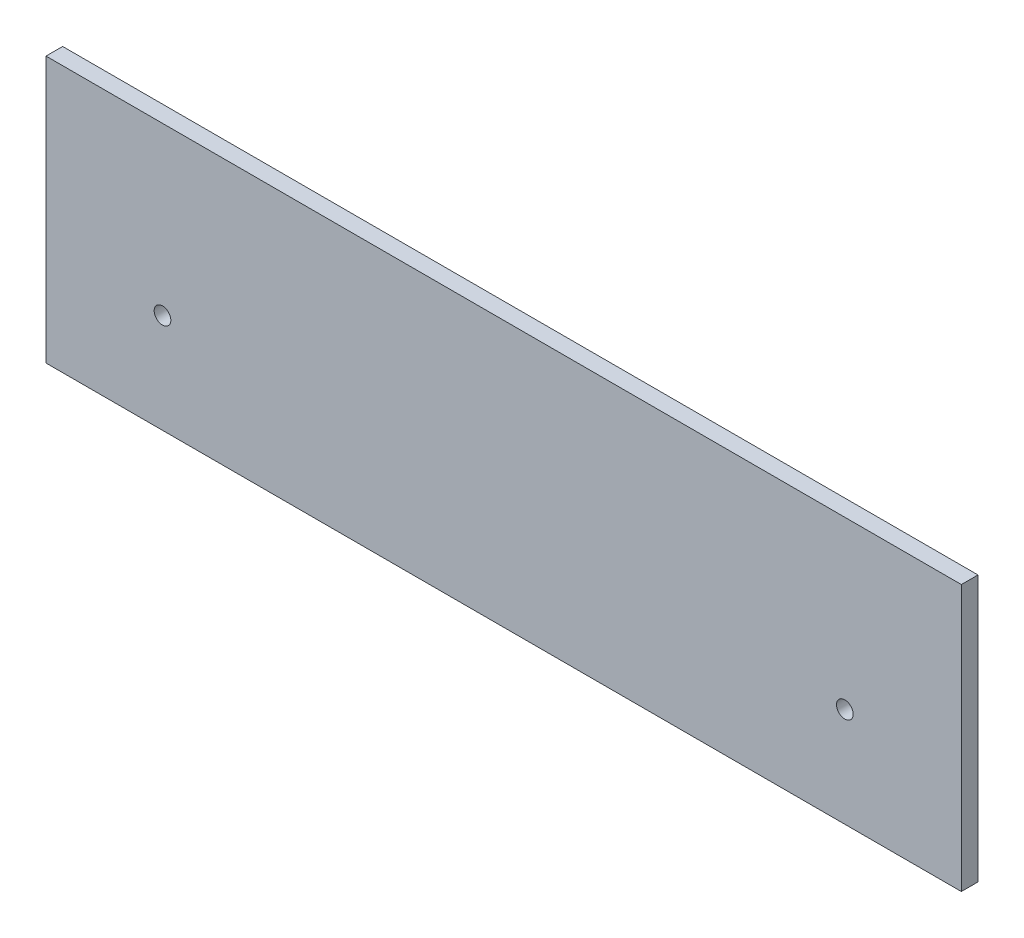
ISO-10303-21;
HEADER;
FILE_DESCRIPTION(('STEP AP214'),'2;1');
FILE_NAME('part.step','',(''),(''),'','','');
FILE_SCHEMA(('AUTOMOTIVE_DESIGN { 1 0 10303 214 1 1 1 1 }'));
ENDSEC;
DATA;
#1=APPLICATION_CONTEXT('core data for automotive mechanical design processes');
#2=APPLICATION_PROTOCOL_DEFINITION('international standard','automotive_design',2000,#1);
#3=PRODUCT_CONTEXT('',#1,'mechanical');
#4=PRODUCT('Part','Part','',(#3));
#5=PRODUCT_RELATED_PRODUCT_CATEGORY('part','',(#4));
#6=PRODUCT_DEFINITION_FORMATION('','',#4);
#7=PRODUCT_DEFINITION_CONTEXT('part definition',#1,'design');
#8=PRODUCT_DEFINITION('design','',#6,#7);
#9=PRODUCT_DEFINITION_SHAPE('','',#8);
#10=(LENGTH_UNIT() NAMED_UNIT(*) SI_UNIT(.MILLI.,.METRE.));
#11=(NAMED_UNIT(*) PLANE_ANGLE_UNIT() SI_UNIT($,.RADIAN.));
#12=(NAMED_UNIT(*) SI_UNIT($,.STERADIAN.) SOLID_ANGLE_UNIT());
#13=UNCERTAINTY_MEASURE_WITH_UNIT(LENGTH_MEASURE(1.E-05),#10,'distance_accuracy_value','');
#14=(GEOMETRIC_REPRESENTATION_CONTEXT(3) GLOBAL_UNCERTAINTY_ASSIGNED_CONTEXT((#13)) GLOBAL_UNIT_ASSIGNED_CONTEXT((#10,
#11,#12)) REPRESENTATION_CONTEXT('',''));
#15=CARTESIAN_POINT('',(0.,0.,0.));
#16=DIRECTION('',(0.,0.,1.));
#17=DIRECTION('',(1.,0.,0.));
#18=AXIS2_PLACEMENT_3D('',#15,#16,#17);
#19=CARTESIAN_POINT('',(0.,0.,1.));
#20=DIRECTION('',(1.,0.,0.));
#21=DIRECTION('',(0.,1.,0.));
#22=AXIS2_PLACEMENT_3D('',#19,#20,#21);
#23=PLANE('',#22);
#24=DIRECTION('',(0.,-1.,0.));
#25=VECTOR('',#24,1.);
#26=CARTESIAN_POINT('',(0.,0.,0.));
#27=LINE('',#26,#25);
#28=CARTESIAN_POINT('',(0.,0.,0.));
#29=VERTEX_POINT('',#28);
#30=CARTESIAN_POINT('',(0.,-15.9756079747164,0.));
#31=VERTEX_POINT('',#30);
#32=EDGE_CURVE('E92',#29,#31,#27,.T.);
#33=ORIENTED_EDGE('',*,*,#32,.T.);
#34=DIRECTION('',(0.,0.,1.));
#35=VECTOR('',#34,1.);
#36=CARTESIAN_POINT('',(0.,-15.9756079747164,-4.));
#37=LINE('',#36,#35);
#38=CARTESIAN_POINT('',(0.,-15.9756079747164,1.));
#39=VERTEX_POINT('',#38);
#40=EDGE_CURVE('E57',#31,#39,#37,.T.);
#41=ORIENTED_EDGE('',*,*,#40,.T.);
#42=DIRECTION('',(0.,-1.,0.));
#43=VECTOR('',#42,1.);
#44=CARTESIAN_POINT('',(0.,0.,1.));
#45=LINE('',#44,#43);
#46=CARTESIAN_POINT('',(0.,0.,1.));
#47=VERTEX_POINT('',#46);
#48=EDGE_CURVE('E87',#47,#39,#45,.T.);
#49=ORIENTED_EDGE('',*,*,#48,.F.);
#50=DIRECTION('',(0.,0.,-1.));
#51=VECTOR('',#50,1.);
#52=CARTESIAN_POINT('',(0.,0.,1.));
#53=LINE('',#52,#51);
#54=EDGE_CURVE('E81',#47,#29,#53,.T.);
#55=ORIENTED_EDGE('',*,*,#54,.T.);
#56=EDGE_LOOP('',(#33,#41,#49,#55));
#57=FACE_BOUND('',#56,.T.);
#58=ADVANCED_FACE('F43',(#57),#23,.F.);
#59=CARTESIAN_POINT('',(55.,0.,1.));
#60=DIRECTION('',(-1.,0.,0.));
#61=DIRECTION('',(0.,-1.,0.));
#62=AXIS2_PLACEMENT_3D('',#59,#60,#61);
#63=PLANE('',#62);
#64=DIRECTION('',(0.,1.,0.));
#65=VECTOR('',#64,1.);
#66=CARTESIAN_POINT('',(55.,0.,1.));
#67=LINE('',#66,#65);
#68=CARTESIAN_POINT('',(55.,-15.9756079747164,1.));
#69=VERTEX_POINT('',#68);
#70=CARTESIAN_POINT('',(55.,0.,1.));
#71=VERTEX_POINT('',#70);
#72=EDGE_CURVE('E103',#69,#71,#67,.T.);
#73=ORIENTED_EDGE('',*,*,#72,.F.);
#74=DIRECTION('',(0.,0.,1.));
#75=VECTOR('',#74,1.);
#76=CARTESIAN_POINT('',(55.,-15.9756079747164,-4.));
#77=LINE('',#76,#75);
#78=CARTESIAN_POINT('',(55.,-15.9756079747164,0.));
#79=VERTEX_POINT('',#78);
#80=EDGE_CURVE('E114',#79,#69,#77,.T.);
#81=ORIENTED_EDGE('',*,*,#80,.F.);
#82=DIRECTION('',(0.,1.,0.));
#83=VECTOR('',#82,1.);
#84=CARTESIAN_POINT('',(55.,0.,0.));
#85=LINE('',#84,#83);
#86=CARTESIAN_POINT('',(55.,0.,0.));
#87=VERTEX_POINT('',#86);
#88=EDGE_CURVE('E88',#79,#87,#85,.T.);
#89=ORIENTED_EDGE('',*,*,#88,.T.);
#90=DIRECTION('',(0.,0.,-1.));
#91=VECTOR('',#90,1.);
#92=CARTESIAN_POINT('',(55.,0.,1.));
#93=LINE('',#92,#91);
#94=EDGE_CURVE('E50',#71,#87,#93,.T.);
#95=ORIENTED_EDGE('',*,*,#94,.F.);
#96=EDGE_LOOP('',(#73,#81,#89,#95));
#97=FACE_BOUND('',#96,.T.);
#98=ADVANCED_FACE('F150',(#97),#63,.F.);
#99=CARTESIAN_POINT('',(0.,0.,1.));
#100=DIRECTION('',(0.,-1.,0.));
#101=DIRECTION('',(0.,0.,-1.));
#102=AXIS2_PLACEMENT_3D('',#99,#100,#101);
#103=PLANE('',#102);
#104=DIRECTION('',(-1.,0.,0.));
#105=VECTOR('',#104,1.);
#106=CARTESIAN_POINT('',(0.,0.,0.));
#107=LINE('',#106,#105);
#108=EDGE_CURVE('E78',#87,#29,#107,.T.);
#109=ORIENTED_EDGE('',*,*,#108,.T.);
#110=ORIENTED_EDGE('',*,*,#54,.F.);
#111=DIRECTION('',(-1.,0.,0.));
#112=VECTOR('',#111,1.);
#113=CARTESIAN_POINT('',(0.,0.,1.));
#114=LINE('',#113,#112);
#115=EDGE_CURVE('E65',#71,#47,#114,.T.);
#116=ORIENTED_EDGE('',*,*,#115,.F.);
#117=ORIENTED_EDGE('',*,*,#94,.T.);
#118=EDGE_LOOP('',(#109,#110,#116,#117));
#119=FACE_BOUND('',#118,.T.);
#120=ADVANCED_FACE('F80',(#119),#103,.F.);
#121=CARTESIAN_POINT('',(0.,0.,1.));
#122=DIRECTION('',(0.,0.,1.));
#123=DIRECTION('',(1.,0.,0.));
#124=AXIS2_PLACEMENT_3D('',#121,#122,#123);
#125=PLANE('',#124);
#126=DIRECTION('',(-1.,0.,0.));
#127=VECTOR('',#126,1.);
#128=CARTESIAN_POINT('',(0.,-15.9756079747164,1.));
#129=LINE('',#128,#127);
#130=EDGE_CURVE('E117',#69,#39,#129,.T.);
#131=ORIENTED_EDGE('',*,*,#130,.F.);
#132=ORIENTED_EDGE('',*,*,#72,.T.);
#133=ORIENTED_EDGE('',*,*,#115,.T.);
#134=ORIENTED_EDGE('',*,*,#48,.T.);
#135=EDGE_LOOP('',(#131,#132,#133,#134));
#136=FACE_BOUND('',#135,.T.);
#137=CARTESIAN_POINT('',(48.,-9.99999999999999,1.));
#138=DIRECTION('',(0.,0.,-1.));
#139=DIRECTION('',(-1.,0.,0.));
#140=AXIS2_PLACEMENT_3D('',#137,#138,#139);
#141=CIRCLE('',#140,0.500000000000002);
#142=CARTESIAN_POINT('',(47.5,-9.99999999999999,1.));
#143=VERTEX_POINT('',#142);
#144=EDGE_CURVE('E109',#143,#143,#141,.T.);
#145=ORIENTED_EDGE('',*,*,#144,.T.);
#146=EDGE_LOOP('',(#145));
#147=FACE_BOUND('',#146,.T.);
#148=CARTESIAN_POINT('',(7.,-10.,1.));
#149=DIRECTION('',(0.,0.,1.));
#150=DIRECTION('',(1.,0.,0.));
#151=AXIS2_PLACEMENT_3D('',#148,#149,#150);
#152=CIRCLE('',#151,0.500000000000002);
#153=CARTESIAN_POINT('',(7.5,-10.,1.));
#154=VERTEX_POINT('',#153);
#155=EDGE_CURVE('E99',#154,#154,#152,.T.);
#156=ORIENTED_EDGE('',*,*,#155,.F.);
#157=EDGE_LOOP('',(#156));
#158=FACE_BOUND('',#157,.T.);
#159=ADVANCED_FACE('F126',(#136,#147,#158),#125,.T.);
#160=CARTESIAN_POINT('',(0.,0.,0.));
#161=DIRECTION('',(0.,0.,1.));
#162=DIRECTION('',(1.,0.,0.));
#163=AXIS2_PLACEMENT_3D('',#160,#161,#162);
#164=PLANE('',#163);
#165=CARTESIAN_POINT('',(48.,-9.99999999999999,0.));
#166=DIRECTION('',(0.,0.,-1.));
#167=DIRECTION('',(-1.,0.,0.));
#168=AXIS2_PLACEMENT_3D('',#165,#166,#167);
#169=CIRCLE('',#168,0.500000000000002);
#170=CARTESIAN_POINT('',(47.5,-9.99999999999999,0.));
#171=VERTEX_POINT('',#170);
#172=EDGE_CURVE('E107',#171,#171,#169,.T.);
#173=ORIENTED_EDGE('',*,*,#172,.F.);
#174=EDGE_LOOP('',(#173));
#175=FACE_BOUND('',#174,.T.);
#176=CARTESIAN_POINT('',(7.,-10.,0.));
#177=DIRECTION('',(0.,0.,1.));
#178=DIRECTION('',(1.,0.,0.));
#179=AXIS2_PLACEMENT_3D('',#176,#177,#178);
#180=CIRCLE('',#179,0.500000000000002);
#181=CARTESIAN_POINT('',(7.5,-10.,0.));
#182=VERTEX_POINT('',#181);
#183=EDGE_CURVE('E95',#182,#182,#180,.T.);
#184=ORIENTED_EDGE('',*,*,#183,.T.);
#185=EDGE_LOOP('',(#184));
#186=FACE_BOUND('',#185,.T.);
#187=ORIENTED_EDGE('',*,*,#88,.F.);
#188=DIRECTION('',(-1.,0.,0.));
#189=VECTOR('',#188,1.);
#190=CARTESIAN_POINT('',(0.,-15.9756079747164,0.));
#191=LINE('',#190,#189);
#192=EDGE_CURVE('E11',#79,#31,#191,.T.);
#193=ORIENTED_EDGE('',*,*,#192,.T.);
#194=ORIENTED_EDGE('',*,*,#32,.F.);
#195=ORIENTED_EDGE('',*,*,#108,.F.);
#196=EDGE_LOOP('',(#187,#193,#194,#195));
#197=FACE_BOUND('',#196,.T.);
#198=ADVANCED_FACE('F94',(#175,#186,#197),#164,.F.);
#199=CARTESIAN_POINT('',(7.,-10.,0.));
#200=DIRECTION('',(0.,0.,1.));
#201=DIRECTION('',(1.,0.,0.));
#202=AXIS2_PLACEMENT_3D('',#199,#200,#201);
#203=CYLINDRICAL_SURFACE('',#202,0.500000000000002);
#204=ORIENTED_EDGE('',*,*,#183,.F.);
#205=EDGE_LOOP('',(#204));
#206=FACE_BOUND('',#205,.T.);
#207=ORIENTED_EDGE('',*,*,#155,.T.);
#208=EDGE_LOOP('',(#207));
#209=FACE_BOUND('',#208,.T.);
#210=ADVANCED_FACE('F134',(#206,#209),#203,.F.);
#211=CARTESIAN_POINT('',(48.,-9.99999999999999,0.));
#212=DIRECTION('',(0.,0.,1.));
#213=DIRECTION('',(1.,0.,0.));
#214=AXIS2_PLACEMENT_3D('',#211,#212,#213);
#215=CYLINDRICAL_SURFACE('',#214,0.500000000000002);
#216=ORIENTED_EDGE('',*,*,#172,.T.);
#217=EDGE_LOOP('',(#216));
#218=FACE_BOUND('',#217,.T.);
#219=ORIENTED_EDGE('',*,*,#144,.F.);
#220=EDGE_LOOP('',(#219));
#221=FACE_BOUND('',#220,.T.);
#222=ADVANCED_FACE('F136',(#218,#221),#215,.F.);
#223=CARTESIAN_POINT('',(0.,-15.9756079747164,-4.));
#224=DIRECTION('',(0.,1.,0.));
#225=DIRECTION('',(0.,0.,1.));
#226=AXIS2_PLACEMENT_3D('',#223,#224,#225);
#227=PLANE('',#226);
#228=ORIENTED_EDGE('',*,*,#80,.T.);
#229=ORIENTED_EDGE('',*,*,#130,.T.);
#230=ORIENTED_EDGE('',*,*,#40,.F.);
#231=ORIENTED_EDGE('',*,*,#192,.F.);
#232=EDGE_LOOP('',(#228,#229,#230,#231));
#233=FACE_BOUND('',#232,.T.);
#234=ADVANCED_FACE('F121',(#233),#227,.F.);
#235=CLOSED_SHELL('',(#58,#98,#120,#159,#198,#210,#222,#234));
#236=MANIFOLD_SOLID_BREP('B2',#235);
#237=ADVANCED_BREP_SHAPE_REPRESENTATION('',(#18,#236),#14);
#238=SHAPE_DEFINITION_REPRESENTATION(#9,#237);
ENDSEC;
END-ISO-10303-21;
